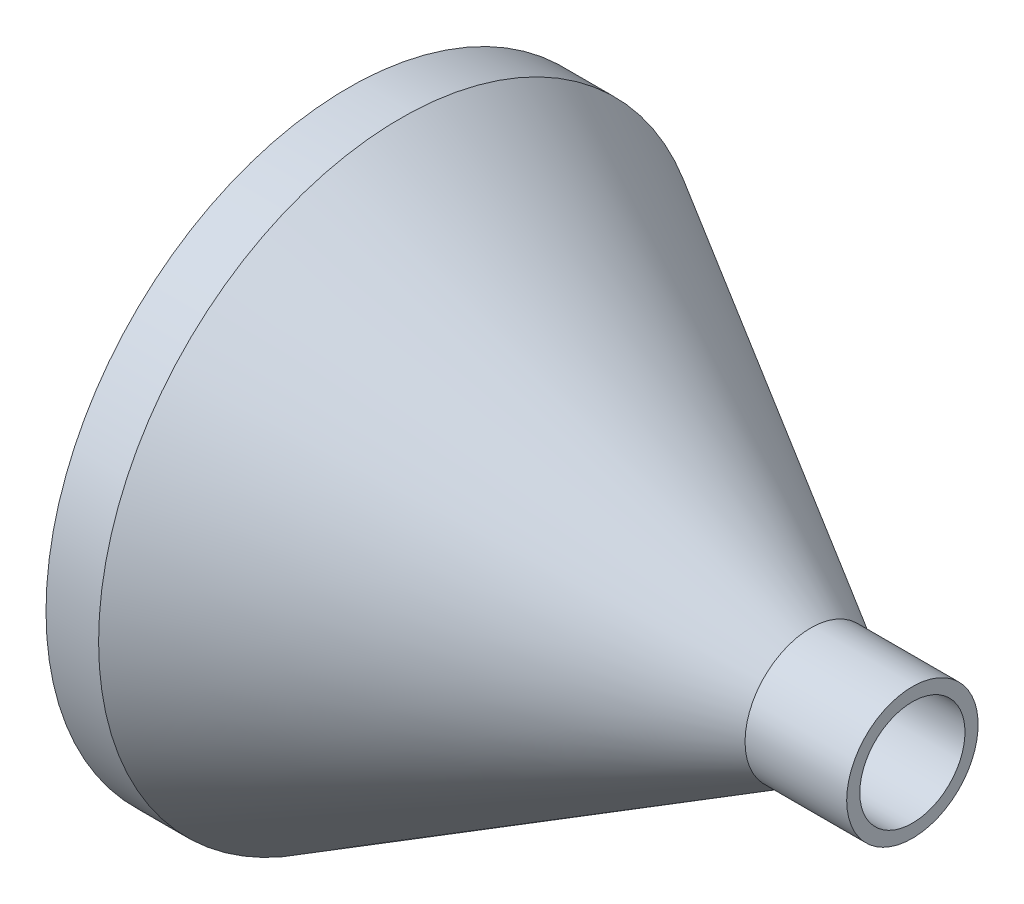
ISO-10303-21;
HEADER;
FILE_DESCRIPTION(('STEP AP214'),'2;1');
FILE_NAME('part.step','',(''),(''),'','','');
FILE_SCHEMA(('AUTOMOTIVE_DESIGN { 1 0 10303 214 1 1 1 1 }'));
ENDSEC;
DATA;
#1=APPLICATION_CONTEXT('core data for automotive mechanical design processes');
#2=APPLICATION_PROTOCOL_DEFINITION('international standard','automotive_design',2000,#1);
#3=PRODUCT_CONTEXT('',#1,'mechanical');
#4=PRODUCT('Part','Part','',(#3));
#5=PRODUCT_RELATED_PRODUCT_CATEGORY('part','',(#4));
#6=PRODUCT_DEFINITION_FORMATION('','',#4);
#7=PRODUCT_DEFINITION_CONTEXT('part definition',#1,'design');
#8=PRODUCT_DEFINITION('design','',#6,#7);
#9=PRODUCT_DEFINITION_SHAPE('','',#8);
#10=(LENGTH_UNIT() NAMED_UNIT(*) SI_UNIT(.MILLI.,.METRE.));
#11=(NAMED_UNIT(*) PLANE_ANGLE_UNIT() SI_UNIT($,.RADIAN.));
#12=(NAMED_UNIT(*) SI_UNIT($,.STERADIAN.) SOLID_ANGLE_UNIT());
#13=UNCERTAINTY_MEASURE_WITH_UNIT(LENGTH_MEASURE(1.E-05),#10,'distance_accuracy_value','');
#14=(GEOMETRIC_REPRESENTATION_CONTEXT(3) GLOBAL_UNCERTAINTY_ASSIGNED_CONTEXT((#13)) GLOBAL_UNIT_ASSIGNED_CONTEXT((#10,
#11,#12)) REPRESENTATION_CONTEXT('',''));
#15=CARTESIAN_POINT('',(0.,0.,0.));
#16=DIRECTION('',(0.,0.,1.));
#17=DIRECTION('',(1.,0.,0.));
#18=AXIS2_PLACEMENT_3D('',#15,#16,#17);
#19=CARTESIAN_POINT('',(0.,0.,0.));
#20=DIRECTION('',(-1.,0.,0.));
#21=DIRECTION('',(0.,0.,1.));
#22=AXIS2_PLACEMENT_3D('',#19,#20,#21);
#23=CYLINDRICAL_SURFACE('',#22,73.025);
#24=CARTESIAN_POINT('',(0.,0.,0.));
#25=DIRECTION('',(-1.,0.,0.));
#26=DIRECTION('',(0.,0.,1.));
#27=AXIS2_PLACEMENT_3D('',#24,#25,#26);
#28=CIRCLE('',#27,73.025);
#29=CARTESIAN_POINT('',(0.,0.,73.025));
#30=VERTEX_POINT('',#29);
#31=EDGE_CURVE('E10',#30,#30,#28,.T.);
#32=ORIENTED_EDGE('',*,*,#31,.F.);
#33=EDGE_LOOP('',(#32));
#34=FACE_BOUND('',#33,.T.);
#35=CARTESIAN_POINT('',(12.7,0.,0.));
#36=DIRECTION('',(-1.,0.,0.));
#37=DIRECTION('',(0.,0.,1.));
#38=AXIS2_PLACEMENT_3D('',#35,#36,#37);
#39=CIRCLE('',#38,73.025);
#40=CARTESIAN_POINT('',(12.7,0.,73.025));
#41=VERTEX_POINT('',#40);
#42=EDGE_CURVE('E61',#41,#41,#39,.T.);
#43=ORIENTED_EDGE('',*,*,#42,.T.);
#44=EDGE_LOOP('',(#43));
#45=FACE_BOUND('',#44,.T.);
#46=ADVANCED_FACE('F33',(#34,#45),#23,.T.);
#47=CARTESIAN_POINT('',(0.,73.025,0.));
#48=DIRECTION('',(1.,0.,0.));
#49=DIRECTION('',(0.,0.,-1.));
#50=AXIS2_PLACEMENT_3D('',#47,#48,#49);
#51=PLANE('',#50);
#52=CARTESIAN_POINT('',(0.,0.,0.));
#53=DIRECTION('',(-1.,0.,0.));
#54=DIRECTION('',(0.,0.,1.));
#55=AXIS2_PLACEMENT_3D('',#52,#53,#54);
#56=CIRCLE('',#55,69.85);
#57=CARTESIAN_POINT('',(0.,0.,69.85));
#58=VERTEX_POINT('',#57);
#59=EDGE_CURVE('E39',#58,#58,#56,.T.);
#60=ORIENTED_EDGE('',*,*,#59,.F.);
#61=EDGE_LOOP('',(#60));
#62=FACE_BOUND('',#61,.T.);
#63=ORIENTED_EDGE('',*,*,#31,.T.);
#64=EDGE_LOOP('',(#63));
#65=FACE_BOUND('',#64,.T.);
#66=ADVANCED_FACE('F98',(#62,#65),#51,.F.);
#67=CARTESIAN_POINT('',(0.,0.,0.));
#68=DIRECTION('',(-1.,0.,0.));
#69=DIRECTION('',(0.,0.,1.));
#70=AXIS2_PLACEMENT_3D('',#67,#68,#69);
#71=CYLINDRICAL_SURFACE('',#70,69.85);
#72=CARTESIAN_POINT('',(11.8492613140312,0.,0.));
#73=DIRECTION('',(-1.,0.,0.));
#74=DIRECTION('',(0.,0.,1.));
#75=AXIS2_PLACEMENT_3D('',#72,#73,#74);
#76=CIRCLE('',#75,69.85);
#77=CARTESIAN_POINT('',(11.8492613140312,0.,69.85));
#78=VERTEX_POINT('',#77);
#79=EDGE_CURVE('E43',#78,#78,#76,.T.);
#80=ORIENTED_EDGE('',*,*,#79,.F.);
#81=EDGE_LOOP('',(#80));
#82=FACE_BOUND('',#81,.T.);
#83=ORIENTED_EDGE('',*,*,#59,.T.);
#84=EDGE_LOOP('',(#83));
#85=FACE_BOUND('',#84,.T.);
#86=ADVANCED_FACE('F93',(#82,#85),#71,.F.);
#87=CARTESIAN_POINT('',(11.8492613140312,0.,0.));
#88=DIRECTION('',(-1.,0.,0.));
#89=DIRECTION('',(0.,0.,1.));
#90=AXIS2_PLACEMENT_3D('',#87,#88,#89);
#91=CONICAL_SURFACE('',#90,69.85,0.5235987755983);
#92=CARTESIAN_POINT('',(110.835964966592,0.,0.));
#93=DIRECTION('',(-1.,0.,0.));
#94=DIRECTION('',(0.,0.,1.));
#95=AXIS2_PLACEMENT_3D('',#92,#93,#94);
#96=CIRCLE('',#95,12.7);
#97=CARTESIAN_POINT('',(110.835964966592,0.,12.7));
#98=VERTEX_POINT('',#97);
#99=EDGE_CURVE('E47',#98,#98,#96,.T.);
#100=CARTESIAN_POINT('',(110.835964966592,0.,12.7));
#101=CARTESIAN_POINT('',(109.804853470211,0.,13.2953125));
#102=CARTESIAN_POINT('',(108.773741973831,0.,13.890625));
#103=CARTESIAN_POINT('',(106.711518981069,0.,15.08125));
#104=CARTESIAN_POINT('',(105.680407484688,0.,15.6765625));
#105=CARTESIAN_POINT('',(103.618184491926,0.,16.8671875));
#106=CARTESIAN_POINT('',(102.587072995545,0.,17.4625));
#107=CARTESIAN_POINT('',(100.524850002784,0.,18.653125));
#108=CARTESIAN_POINT('',(99.4937385064029,0.,19.2484375));
#109=CARTESIAN_POINT('',(97.4315155136412,0.,20.4390625));
#110=CARTESIAN_POINT('',(96.4004040172604,0.,21.034375));
#111=CARTESIAN_POINT('',(94.3381810244987,0.,22.225));
#112=CARTESIAN_POINT('',(93.3070695281179,0.,22.8203125));
#113=CARTESIAN_POINT('',(91.2448465353562,0.,24.0109375));
#114=CARTESIAN_POINT('',(90.2137350389753,0.,24.60625));
#115=CARTESIAN_POINT('',(88.1515120462137,0.,25.796875));
#116=CARTESIAN_POINT('',(87.1204005498328,0.,26.3921875));
#117=CARTESIAN_POINT('',(85.0581775570711,0.,27.5828125));
#118=CARTESIAN_POINT('',(84.0270660606903,0.,28.178125));
#119=CARTESIAN_POINT('',(81.9648430679286,0.,29.36875));
#120=CARTESIAN_POINT('',(80.9337315715477,0.,29.9640625));
#121=CARTESIAN_POINT('',(78.871508578786,0.,31.1546875));
#122=CARTESIAN_POINT('',(77.8403970824052,0.,31.75));
#123=CARTESIAN_POINT('',(75.7781740896435,0.,32.940625));
#124=CARTESIAN_POINT('',(74.7470625932627,0.,33.5359375));
#125=CARTESIAN_POINT('',(72.684839600501,0.,34.7265625));
#126=CARTESIAN_POINT('',(71.6537281041201,0.,35.321875));
#127=CARTESIAN_POINT('',(69.5915051113584,0.,36.5125));
#128=CARTESIAN_POINT('',(68.5603936149776,0.,37.1078125));
#129=CARTESIAN_POINT('',(66.4981706222159,0.,38.2984375));
#130=CARTESIAN_POINT('',(65.4670591258351,0.,38.89375));
#131=CARTESIAN_POINT('',(63.4048361330734,0.,40.084375));
#132=CARTESIAN_POINT('',(62.3737246366925,0.,40.6796875));
#133=CARTESIAN_POINT('',(60.3115016439308,0.,41.8703125));
#134=CARTESIAN_POINT('',(59.28039014755,0.,42.465625));
#135=CARTESIAN_POINT('',(57.2181671547883,0.,43.65625));
#136=CARTESIAN_POINT('',(56.1870556584075,0.,44.2515625));
#137=CARTESIAN_POINT('',(54.1248326656458,0.,45.4421875));
#138=CARTESIAN_POINT('',(53.0937211692649,0.,46.0375));
#139=CARTESIAN_POINT('',(51.0314981765032,0.,47.228125));
#140=CARTESIAN_POINT('',(50.0003866801224,0.,47.8234375));
#141=CARTESIAN_POINT('',(47.9381636873607,0.,49.0140625));
#142=CARTESIAN_POINT('',(46.9070521909799,0.,49.609375));
#143=CARTESIAN_POINT('',(44.8448291982182,0.,50.8));
#144=CARTESIAN_POINT('',(43.8137177018373,0.,51.3953125));
#145=CARTESIAN_POINT('',(41.7514947090757,0.,52.5859375));
#146=CARTESIAN_POINT('',(40.7203832126948,0.,53.18125));
#147=CARTESIAN_POINT('',(38.6581602199331,0.,54.371875));
#148=CARTESIAN_POINT('',(37.6270487235523,0.,54.9671875));
#149=CARTESIAN_POINT('',(35.5648257307906,0.,56.1578125));
#150=CARTESIAN_POINT('',(34.5337142344097,0.,56.753125));
#151=CARTESIAN_POINT('',(32.471491241648,0.,57.94375));
#152=CARTESIAN_POINT('',(31.4403797452672,0.,58.5390625));
#153=CARTESIAN_POINT('',(29.3781567525055,0.,59.7296875));
#154=CARTESIAN_POINT('',(28.3470452561247,0.,60.325));
#155=CARTESIAN_POINT('',(26.284822263363,0.,61.515625));
#156=CARTESIAN_POINT('',(25.2537107669821,0.,62.1109375));
#157=CARTESIAN_POINT('',(23.1914877742205,0.,63.3015625));
#158=CARTESIAN_POINT('',(22.1603762778396,0.,63.896875));
#159=CARTESIAN_POINT('',(20.0981532850779,0.,65.0875));
#160=CARTESIAN_POINT('',(19.0670417886971,0.,65.6828125));
#161=CARTESIAN_POINT('',(17.0048187959354,0.,66.8734375));
#162=CARTESIAN_POINT('',(15.9737072995545,0.,67.46875));
#163=CARTESIAN_POINT('',(13.9114843067928,0.,68.659375));
#164=CARTESIAN_POINT('',(12.880372810412,0.,69.2546875));
#165=CARTESIAN_POINT('',(11.8492613140312,0.,69.85));
#166=B_SPLINE_CURVE_WITH_KNOTS('',3,(#100,#101,#102,#103,#104,#105,#106,#107,#108,#109,#110,
#111,#112,#113,#114,#115,#116,#117,#118,#119,#120,#121,#122,#123,#124,#125,#126,#127,#128,#129,
#130,#131,#132,#133,#134,#135,#136,#137,#138,#139,#140,#141,#142,#143,#144,#145,#146,#147,#148,
#149,#150,#151,#152,#153,#154,#155,#156,#157,#158,#159,#160,#161,#162,#163,#164,#165),
.UNSPECIFIED.,.F.,.F.,(4,2,2,2,2,2,2,2,2,2,2,2,2,2,2,2,2,2,2,2,2,2,2,2,2,2,2,2,2,2,2,2,4),(0.,
3.571875,7.14374999999999,10.715625,14.2875,17.859375,21.43125,25.0031249999999,
28.5749999999999,32.1468749999999,35.7187499999999,39.2906249999999,42.8624999999999,
46.4343749999999,50.0062499999999,53.5781249999999,57.1499999999999,60.7218749999999,
64.2937499999999,67.8656249999999,71.4374999999999,75.0093749999999,78.5812499999999,
82.1531249999999,85.7249999999998,89.2968749999998,92.8687499999998,96.4406249999998,100.0125,
103.584375,107.15625,110.728125,114.3),.UNSPECIFIED.);
#167=EDGE_CURVE('BSEAM87',#98,#78,#166,.T.);
#168=ORIENTED_EDGE('',*,*,#99,.F.);
#169=ORIENTED_EDGE('',*,*,#79,.T.);
#170=ORIENTED_EDGE('',*,*,#167,.T.);
#171=ORIENTED_EDGE('',*,*,#167,.F.);
#172=EDGE_LOOP('',(#168,#170,#169,#171));
#173=FACE_BOUND('',#172,.T.);
#174=ADVANCED_FACE('F87',(#173),#91,.F.);
#175=CARTESIAN_POINT('',(0.,0.,0.));
#176=DIRECTION('',(-1.,0.,0.));
#177=DIRECTION('',(0.,0.,1.));
#178=AXIS2_PLACEMENT_3D('',#175,#176,#177);
#179=CYLINDRICAL_SURFACE('',#178,12.7);
#180=CARTESIAN_POINT('',(136.235964966592,0.,0.));
#181=DIRECTION('',(-1.,0.,0.));
#182=DIRECTION('',(0.,0.,1.));
#183=AXIS2_PLACEMENT_3D('',#180,#181,#182);
#184=CIRCLE('',#183,12.7);
#185=CARTESIAN_POINT('',(136.235964966592,0.,12.7));
#186=VERTEX_POINT('',#185);
#187=EDGE_CURVE('E52',#186,#186,#184,.T.);
#188=ORIENTED_EDGE('',*,*,#187,.F.);
#189=EDGE_LOOP('',(#188));
#190=FACE_BOUND('',#189,.T.);
#191=ORIENTED_EDGE('',*,*,#99,.T.);
#192=EDGE_LOOP('',(#191));
#193=FACE_BOUND('',#192,.T.);
#194=ADVANCED_FACE('F81',(#190,#193),#179,.F.);
#195=CARTESIAN_POINT('',(136.235964966592,12.7,0.));
#196=DIRECTION('',(-1.,0.,0.));
#197=DIRECTION('',(0.,0.,1.));
#198=AXIS2_PLACEMENT_3D('',#195,#196,#197);
#199=PLANE('',#198);
#200=CARTESIAN_POINT('',(136.235964966592,0.,0.));
#201=DIRECTION('',(-1.,0.,0.));
#202=DIRECTION('',(0.,0.,1.));
#203=AXIS2_PLACEMENT_3D('',#200,#201,#202);
#204=CIRCLE('',#203,15.875);
#205=CARTESIAN_POINT('',(136.235964966592,0.,15.875));
#206=VERTEX_POINT('',#205);
#207=EDGE_CURVE('E55',#206,#206,#204,.T.);
#208=ORIENTED_EDGE('',*,*,#207,.F.);
#209=EDGE_LOOP('',(#208));
#210=FACE_BOUND('',#209,.T.);
#211=ORIENTED_EDGE('',*,*,#187,.T.);
#212=EDGE_LOOP('',(#211));
#213=FACE_BOUND('',#212,.T.);
#214=ADVANCED_FACE('F75',(#210,#213),#199,.F.);
#215=CARTESIAN_POINT('',(0.,0.,0.));
#216=DIRECTION('',(-1.,0.,0.));
#217=DIRECTION('',(0.,0.,1.));
#218=AXIS2_PLACEMENT_3D('',#215,#216,#217);
#219=CYLINDRICAL_SURFACE('',#218,15.875);
#220=CARTESIAN_POINT('',(111.686703652561,0.,0.));
#221=DIRECTION('',(-1.,0.,0.));
#222=DIRECTION('',(0.,0.,1.));
#223=AXIS2_PLACEMENT_3D('',#220,#221,#222);
#224=CIRCLE('',#223,15.875);
#225=CARTESIAN_POINT('',(111.686703652561,0.,15.875));
#226=VERTEX_POINT('',#225);
#227=EDGE_CURVE('E58',#226,#226,#224,.T.);
#228=ORIENTED_EDGE('',*,*,#227,.F.);
#229=EDGE_LOOP('',(#228));
#230=FACE_BOUND('',#229,.T.);
#231=ORIENTED_EDGE('',*,*,#207,.T.);
#232=EDGE_LOOP('',(#231));
#233=FACE_BOUND('',#232,.T.);
#234=ADVANCED_FACE('F69',(#230,#233),#219,.T.);
#235=CARTESIAN_POINT('',(111.686703652561,0.,0.));
#236=DIRECTION('',(-1.,0.,0.));
#237=DIRECTION('',(0.,0.,1.));
#238=AXIS2_PLACEMENT_3D('',#235,#236,#237);
#239=CONICAL_SURFACE('',#238,15.875,0.5235987755983);
#240=CARTESIAN_POINT('',(12.7,0.,73.025));
#241=CARTESIAN_POINT('',(13.7311114963808,0.,72.4296875));
#242=CARTESIAN_POINT('',(14.7622229927617,0.,71.834375));
#243=CARTESIAN_POINT('',(16.8244459855234,0.,70.64375));
#244=CARTESIAN_POINT('',(17.8555574819042,0.,70.0484375));
#245=CARTESIAN_POINT('',(19.9177804746659,0.,68.8578125));
#246=CARTESIAN_POINT('',(20.9488919710467,0.,68.2625));
#247=CARTESIAN_POINT('',(23.0111149638084,0.,67.071875));
#248=CARTESIAN_POINT('',(24.0422264601893,0.,66.4765625));
#249=CARTESIAN_POINT('',(26.104449452951,0.,65.2859375));
#250=CARTESIAN_POINT('',(27.1355609493318,0.,64.690625));
#251=CARTESIAN_POINT('',(29.1977839420935,0.,63.5));
#252=CARTESIAN_POINT('',(30.2288954384744,0.,62.9046875));
#253=CARTESIAN_POINT('',(32.2911184312361,0.,61.7140625));
#254=CARTESIAN_POINT('',(33.3222299276169,0.,61.11875));
#255=CARTESIAN_POINT('',(35.3844529203786,0.,59.928125));
#256=CARTESIAN_POINT('',(36.4155644167594,0.,59.3328125));
#257=CARTESIAN_POINT('',(38.4777874095211,0.,58.1421875));
#258=CARTESIAN_POINT('',(39.508898905902,0.,57.546875));
#259=CARTESIAN_POINT('',(41.5711218986637,0.,56.35625));
#260=CARTESIAN_POINT('',(42.6022333950445,0.,55.7609375));
#261=CARTESIAN_POINT('',(44.6644563878062,0.,54.5703125));
#262=CARTESIAN_POINT('',(45.695567884187,0.,53.975));
#263=CARTESIAN_POINT('',(47.7577908769487,0.,52.784375));
#264=CARTESIAN_POINT('',(48.7889023733296,0.,52.1890625));
#265=CARTESIAN_POINT('',(50.8511253660913,0.,50.9984375));
#266=CARTESIAN_POINT('',(51.8822368624721,0.,50.403125));
#267=CARTESIAN_POINT('',(53.9444598552338,0.,49.2125));
#268=CARTESIAN_POINT('',(54.9755713516146,0.,48.6171875));
#269=CARTESIAN_POINT('',(57.0377943443763,0.,47.4265625));
#270=CARTESIAN_POINT('',(58.0689058407572,0.,46.83125));
#271=CARTESIAN_POINT('',(60.1311288335189,0.,45.640625));
#272=CARTESIAN_POINT('',(61.1622403298997,0.,45.0453125));
#273=CARTESIAN_POINT('',(63.2244633226614,0.,43.8546875));
#274=CARTESIAN_POINT('',(64.2555748190423,0.,43.259375));
#275=CARTESIAN_POINT('',(66.3177978118039,0.,42.06875));
#276=CARTESIAN_POINT('',(67.3489093081848,0.,41.4734375));
#277=CARTESIAN_POINT('',(69.4111323009465,0.,40.2828125));
#278=CARTESIAN_POINT('',(70.4422437973273,0.,39.6875));
#279=CARTESIAN_POINT('',(72.504466790089,0.,38.496875));
#280=CARTESIAN_POINT('',(73.5355782864699,0.,37.9015625));
#281=CARTESIAN_POINT('',(75.5978012792315,0.,36.7109375));
#282=CARTESIAN_POINT('',(76.6289127756124,0.,36.115625));
#283=CARTESIAN_POINT('',(78.6911357683741,0.,34.925));
#284=CARTESIAN_POINT('',(79.7222472647549,0.,34.3296875));
#285=CARTESIAN_POINT('',(81.7844702575166,0.,33.1390625));
#286=CARTESIAN_POINT('',(82.8155817538974,0.,32.54375));
#287=CARTESIAN_POINT('',(84.8778047466591,0.,31.353125));
#288=CARTESIAN_POINT('',(85.90891624304,0.,30.7578125));
#289=CARTESIAN_POINT('',(87.9711392358017,0.,29.5671875));
#290=CARTESIAN_POINT('',(89.0022507321825,0.,28.971875));
#291=CARTESIAN_POINT('',(91.0644737249442,0.,27.78125));
#292=CARTESIAN_POINT('',(92.0955852213251,0.,27.1859375));
#293=CARTESIAN_POINT('',(94.1578082140867,0.,25.9953125));
#294=CARTESIAN_POINT('',(95.1889197104676,0.,25.4));
#295=CARTESIAN_POINT('',(97.2511427032293,0.,24.209375));
#296=CARTESIAN_POINT('',(98.2822541996101,0.,23.6140625));
#297=CARTESIAN_POINT('',(100.344477192372,0.,22.4234375));
#298=CARTESIAN_POINT('',(101.375588688753,0.,21.828125));
#299=CARTESIAN_POINT('',(103.437811681514,0.,20.6375));
#300=CARTESIAN_POINT('',(104.468923177895,0.,20.0421875));
#301=CARTESIAN_POINT('',(106.531146170657,0.,18.8515625));
#302=CARTESIAN_POINT('',(107.562257667038,0.,18.25625));
#303=CARTESIAN_POINT('',(109.624480659799,0.,17.065625));
#304=CARTESIAN_POINT('',(110.65559215618,0.,16.4703125));
#305=CARTESIAN_POINT('',(111.686703652561,0.,15.875));
#306=B_SPLINE_CURVE_WITH_KNOTS('',3,(#240,#241,#242,#243,#244,#245,#246,#247,#248,#249,#250,
#251,#252,#253,#254,#255,#256,#257,#258,#259,#260,#261,#262,#263,#264,#265,#266,#267,#268,#269,
#270,#271,#272,#273,#274,#275,#276,#277,#278,#279,#280,#281,#282,#283,#284,#285,#286,#287,#288,
#289,#290,#291,#292,#293,#294,#295,#296,#297,#298,#299,#300,#301,#302,#303,#304,#305),
.UNSPECIFIED.,.F.,.F.,(4,2,2,2,2,2,2,2,2,2,2,2,2,2,2,2,2,2,2,2,2,2,2,2,2,2,2,2,2,2,2,2,4),(0.,
3.571875,7.14374999999999,10.715625,14.2875,17.859375,21.43125,25.003125,28.575,32.146875,
35.7187499999999,39.2906249999999,42.8624999999999,46.4343749999999,50.0062499999999,
53.5781249999999,57.1499999999999,60.7218749999999,64.2937499999999,67.8656249999999,
71.4374999999999,75.0093749999999,78.5812499999999,82.1531249999999,85.7249999999999,
89.2968749999999,92.8687499999999,96.4406249999999,100.0125,103.584375,107.15625,110.728125,
114.3),.UNSPECIFIED.);
#307=EDGE_CURVE('BSEAM66',#41,#226,#306,.T.);
#308=ORIENTED_EDGE('',*,*,#42,.F.);
#309=ORIENTED_EDGE('',*,*,#227,.T.);
#310=ORIENTED_EDGE('',*,*,#307,.T.);
#311=ORIENTED_EDGE('',*,*,#307,.F.);
#312=EDGE_LOOP('',(#308,#310,#309,#311));
#313=FACE_BOUND('',#312,.T.);
#314=ADVANCED_FACE('F66',(#313),#239,.T.);
#315=CLOSED_SHELL('',(#46,#66,#86,#174,#194,#214,#234,#314));
#316=MANIFOLD_SOLID_BREP('B2',#315);
#317=ADVANCED_BREP_SHAPE_REPRESENTATION('',(#18,#316),#14);
#318=SHAPE_DEFINITION_REPRESENTATION(#9,#317);
ENDSEC;
END-ISO-10303-21;
